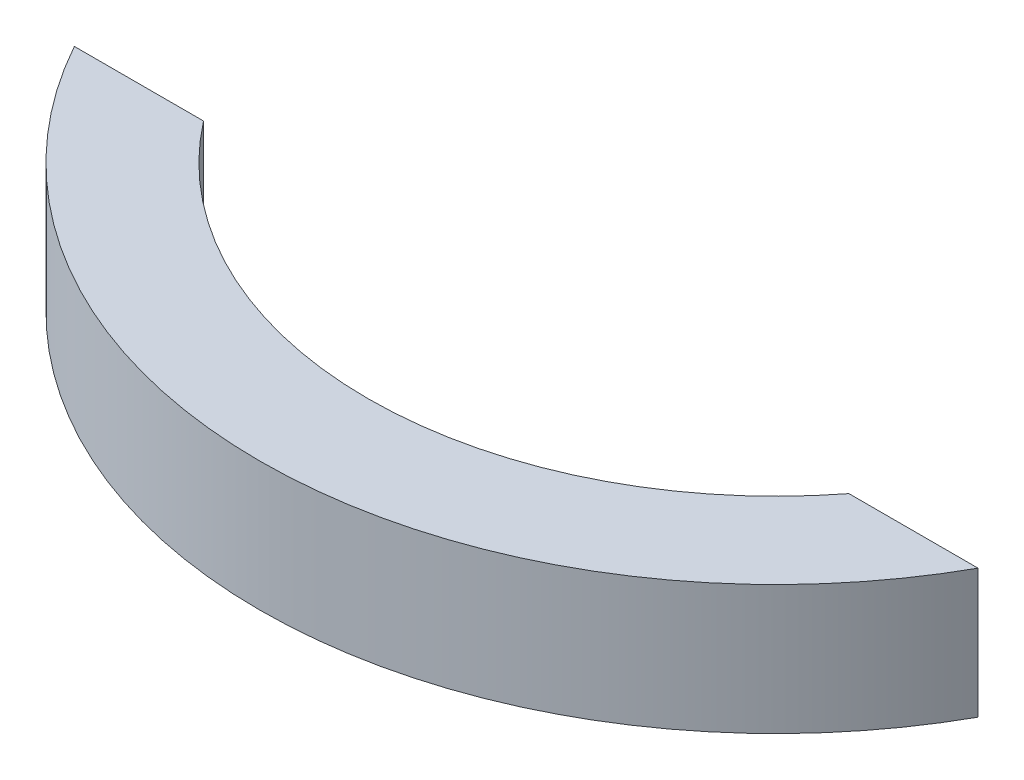
ISO-10303-21;
HEADER;
FILE_DESCRIPTION(('STEP AP214'),'2;1');
FILE_NAME('part.step','',(''),(''),'','','');
FILE_SCHEMA(('AUTOMOTIVE_DESIGN { 1 0 10303 214 1 1 1 1 }'));
ENDSEC;
DATA;
#1=APPLICATION_CONTEXT('core data for automotive mechanical design processes');
#2=APPLICATION_PROTOCOL_DEFINITION('international standard','automotive_design',2000,#1);
#3=PRODUCT_CONTEXT('',#1,'mechanical');
#4=PRODUCT('Part','Part','',(#3));
#5=PRODUCT_RELATED_PRODUCT_CATEGORY('part','',(#4));
#6=PRODUCT_DEFINITION_FORMATION('','',#4);
#7=PRODUCT_DEFINITION_CONTEXT('part definition',#1,'design');
#8=PRODUCT_DEFINITION('design','',#6,#7);
#9=PRODUCT_DEFINITION_SHAPE('','',#8);
#10=(LENGTH_UNIT() NAMED_UNIT(*) SI_UNIT(.MILLI.,.METRE.));
#11=(NAMED_UNIT(*) PLANE_ANGLE_UNIT() SI_UNIT($,.RADIAN.));
#12=(NAMED_UNIT(*) SI_UNIT($,.STERADIAN.) SOLID_ANGLE_UNIT());
#13=UNCERTAINTY_MEASURE_WITH_UNIT(LENGTH_MEASURE(1.E-05),#10,'distance_accuracy_value','');
#14=(GEOMETRIC_REPRESENTATION_CONTEXT(3) GLOBAL_UNCERTAINTY_ASSIGNED_CONTEXT((#13)) GLOBAL_UNIT_ASSIGNED_CONTEXT((#10,
#11,#12)) REPRESENTATION_CONTEXT('',''));
#15=CARTESIAN_POINT('',(0.,0.,0.));
#16=DIRECTION('',(0.,0.,1.));
#17=DIRECTION('',(1.,0.,0.));
#18=AXIS2_PLACEMENT_3D('',#15,#16,#17);
#19=CARTESIAN_POINT('',(-17.5,5.,-5.31754163448146));
#20=DIRECTION('',(0.,0.,-1.));
#21=DIRECTION('',(-1.,0.,0.));
#22=AXIS2_PLACEMENT_3D('',#19,#20,#21);
#23=PLANE('',#22);
#24=DIRECTION('',(1.,0.,0.));
#25=VECTOR('',#24,1.);
#26=CARTESIAN_POINT('',(-17.5,0.,-5.31754163448146));
#27=LINE('',#26,#25);
#28=CARTESIAN_POINT('',(-17.5,0.,-5.31754163448145));
#29=VERTEX_POINT('',#28);
#30=CARTESIAN_POINT('',(-12.5,0.,-5.31754163448147));
#31=VERTEX_POINT('',#30);
#32=EDGE_CURVE('E99',#29,#31,#27,.T.);
#33=ORIENTED_EDGE('',*,*,#32,.F.);
#34=DIRECTION('',(0.,-1.,0.));
#35=VECTOR('',#34,1.);
#36=CARTESIAN_POINT('',(-17.5,5.,-5.31754163448145));
#37=LINE('',#36,#35);
#38=CARTESIAN_POINT('',(-17.5,5.,-5.31754163448145));
#39=VERTEX_POINT('',#38);
#40=EDGE_CURVE('E11',#39,#29,#37,.T.);
#41=ORIENTED_EDGE('',*,*,#40,.F.);
#42=DIRECTION('',(1.,0.,0.));
#43=VECTOR('',#42,1.);
#44=CARTESIAN_POINT('',(-17.5,5.,-5.31754163448146));
#45=LINE('',#44,#43);
#46=CARTESIAN_POINT('',(-12.5,5.,-5.31754163448147));
#47=VERTEX_POINT('',#46);
#48=EDGE_CURVE('E93',#39,#47,#45,.T.);
#49=ORIENTED_EDGE('',*,*,#48,.T.);
#50=DIRECTION('',(0.,-1.,0.));
#51=VECTOR('',#50,1.);
#52=CARTESIAN_POINT('',(-12.5,5.,-5.31754163448147));
#53=LINE('',#52,#51);
#54=EDGE_CURVE('E37',#47,#31,#53,.T.);
#55=ORIENTED_EDGE('',*,*,#54,.T.);
#56=EDGE_LOOP('',(#33,#41,#49,#55));
#57=FACE_BOUND('',#56,.T.);
#58=ADVANCED_FACE('F34',(#57),#23,.T.);
#59=CARTESIAN_POINT('',(0.,5.,-15.));
#60=DIRECTION('',(0.,-1.,0.));
#61=DIRECTION('',(0.,0.,-1.));
#62=AXIS2_PLACEMENT_3D('',#59,#60,#61);
#63=CYLINDRICAL_SURFACE('',#62,20.);
#64=CARTESIAN_POINT('',(0.,0.,-15.));
#65=DIRECTION('',(0.,1.,0.));
#66=DIRECTION('',(0.,0.,1.));
#67=AXIS2_PLACEMENT_3D('',#64,#65,#66);
#68=CIRCLE('',#67,20.);
#69=CARTESIAN_POINT('',(17.5,0.,-5.31754163448145));
#70=VERTEX_POINT('',#69);
#71=EDGE_CURVE('E95',#29,#70,#68,.T.);
#72=ORIENTED_EDGE('',*,*,#71,.T.);
#73=DIRECTION('',(0.,-1.,0.));
#74=VECTOR('',#73,1.);
#75=CARTESIAN_POINT('',(17.5,5.,-5.31754163448145));
#76=LINE('',#75,#74);
#77=CARTESIAN_POINT('',(17.5,5.,-5.31754163448145));
#78=VERTEX_POINT('',#77);
#79=EDGE_CURVE('E43',#78,#70,#76,.T.);
#80=ORIENTED_EDGE('',*,*,#79,.F.);
#81=CARTESIAN_POINT('',(0.,5.,-15.));
#82=DIRECTION('',(0.,1.,0.));
#83=DIRECTION('',(0.,0.,1.));
#84=AXIS2_PLACEMENT_3D('',#81,#82,#83);
#85=CIRCLE('',#84,20.);
#86=EDGE_CURVE('E90',#39,#78,#85,.T.);
#87=ORIENTED_EDGE('',*,*,#86,.F.);
#88=ORIENTED_EDGE('',*,*,#40,.T.);
#89=EDGE_LOOP('',(#72,#80,#87,#88));
#90=FACE_BOUND('',#89,.T.);
#91=ADVANCED_FACE('F106',(#90),#63,.T.);
#92=CARTESIAN_POINT('',(12.5,5.,-5.31754163448146));
#93=DIRECTION('',(0.,0.,-1.));
#94=DIRECTION('',(-1.,0.,0.));
#95=AXIS2_PLACEMENT_3D('',#92,#93,#94);
#96=PLANE('',#95);
#97=DIRECTION('',(1.,0.,0.));
#98=VECTOR('',#97,1.);
#99=CARTESIAN_POINT('',(12.5,0.,-5.31754163448146));
#100=LINE('',#99,#98);
#101=CARTESIAN_POINT('',(12.5,0.,-5.31754163448146));
#102=VERTEX_POINT('',#101);
#103=EDGE_CURVE('E84',#102,#70,#100,.T.);
#104=ORIENTED_EDGE('',*,*,#103,.F.);
#105=DIRECTION('',(0.,-1.,0.));
#106=VECTOR('',#105,1.);
#107=CARTESIAN_POINT('',(12.5,5.,-5.31754163448146));
#108=LINE('',#107,#106);
#109=CARTESIAN_POINT('',(12.5,5.,-5.31754163448146));
#110=VERTEX_POINT('',#109);
#111=EDGE_CURVE('E79',#110,#102,#108,.T.);
#112=ORIENTED_EDGE('',*,*,#111,.F.);
#113=DIRECTION('',(1.,0.,0.));
#114=VECTOR('',#113,1.);
#115=CARTESIAN_POINT('',(12.5,5.,-5.31754163448146));
#116=LINE('',#115,#114);
#117=EDGE_CURVE('E82',#110,#78,#116,.T.);
#118=ORIENTED_EDGE('',*,*,#117,.T.);
#119=ORIENTED_EDGE('',*,*,#79,.T.);
#120=EDGE_LOOP('',(#104,#112,#118,#119));
#121=FACE_BOUND('',#120,.T.);
#122=ADVANCED_FACE('F81',(#121),#96,.T.);
#123=CARTESIAN_POINT('',(0.,5.,-15.));
#124=DIRECTION('',(0.,-1.,0.));
#125=DIRECTION('',(0.,0.,-1.));
#126=AXIS2_PLACEMENT_3D('',#123,#124,#125);
#127=CYLINDRICAL_SURFACE('',#126,15.8113883008419);
#128=CARTESIAN_POINT('',(0.,0.,-15.));
#129=DIRECTION('',(0.,1.,0.));
#130=DIRECTION('',(0.,0.,1.));
#131=AXIS2_PLACEMENT_3D('',#128,#129,#130);
#132=CIRCLE('',#131,15.8113883008419);
#133=EDGE_CURVE('E102',#31,#102,#132,.T.);
#134=ORIENTED_EDGE('',*,*,#133,.F.);
#135=ORIENTED_EDGE('',*,*,#54,.F.);
#136=CARTESIAN_POINT('',(0.,5.,-15.));
#137=DIRECTION('',(0.,1.,0.));
#138=DIRECTION('',(0.,0.,1.));
#139=AXIS2_PLACEMENT_3D('',#136,#137,#138);
#140=CIRCLE('',#139,15.8113883008419);
#141=EDGE_CURVE('E89',#47,#110,#140,.T.);
#142=ORIENTED_EDGE('',*,*,#141,.T.);
#143=ORIENTED_EDGE('',*,*,#111,.T.);
#144=EDGE_LOOP('',(#134,#135,#142,#143));
#145=FACE_BOUND('',#144,.T.);
#146=ADVANCED_FACE('F92',(#145),#127,.F.);
#147=CARTESIAN_POINT('',(0.,5.,-15.));
#148=DIRECTION('',(0.,1.,0.));
#149=DIRECTION('',(0.,0.,1.));
#150=AXIS2_PLACEMENT_3D('',#147,#148,#149);
#151=PLANE('',#150);
#152=ORIENTED_EDGE('',*,*,#48,.F.);
#153=ORIENTED_EDGE('',*,*,#86,.T.);
#154=ORIENTED_EDGE('',*,*,#117,.F.);
#155=ORIENTED_EDGE('',*,*,#141,.F.);
#156=EDGE_LOOP('',(#152,#153,#154,#155));
#157=FACE_BOUND('',#156,.T.);
#158=ADVANCED_FACE('F88',(#157),#151,.T.);
#159=CARTESIAN_POINT('',(0.,0.,-15.));
#160=DIRECTION('',(0.,1.,0.));
#161=DIRECTION('',(0.,0.,1.));
#162=AXIS2_PLACEMENT_3D('',#159,#160,#161);
#163=PLANE('',#162);
#164=ORIENTED_EDGE('',*,*,#32,.T.);
#165=ORIENTED_EDGE('',*,*,#133,.T.);
#166=ORIENTED_EDGE('',*,*,#103,.T.);
#167=ORIENTED_EDGE('',*,*,#71,.F.);
#168=EDGE_LOOP('',(#164,#165,#166,#167));
#169=FACE_BOUND('',#168,.T.);
#170=ADVANCED_FACE('F108',(#169),#163,.F.);
#171=CLOSED_SHELL('',(#58,#91,#122,#146,#158,#170));
#172=MANIFOLD_SOLID_BREP('B2',#171);
#173=ADVANCED_BREP_SHAPE_REPRESENTATION('',(#18,#172),#14);
#174=SHAPE_DEFINITION_REPRESENTATION(#9,#173);
ENDSEC;
END-ISO-10303-21;
